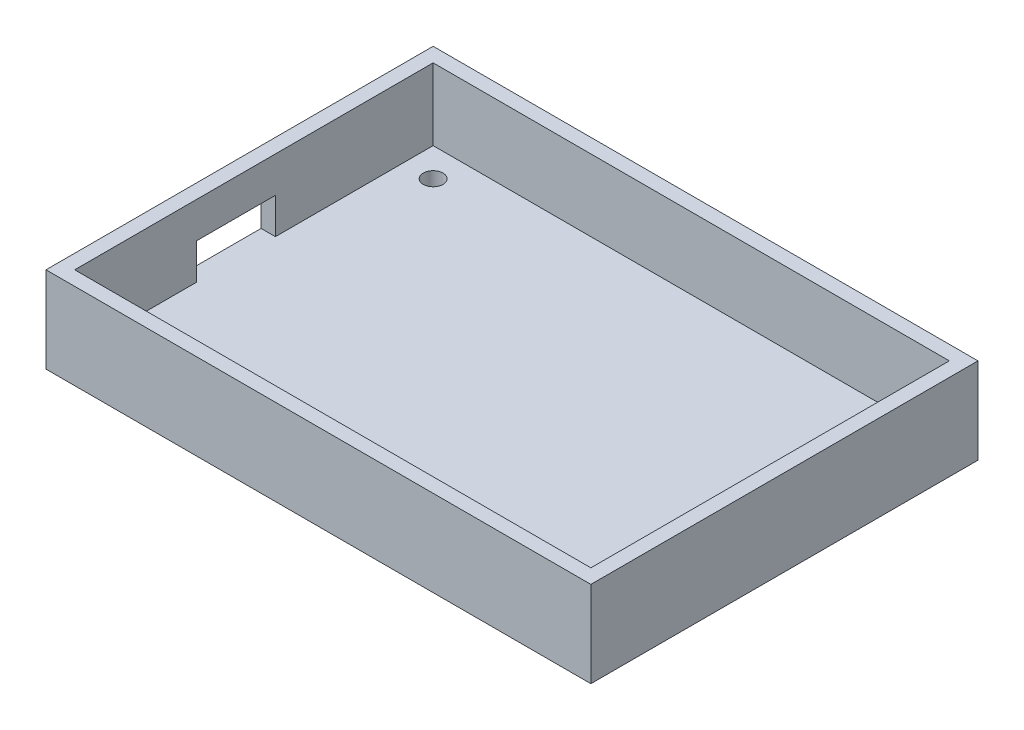
ISO-10303-21;
HEADER;
FILE_DESCRIPTION(('STEP AP214'),'2;1');
FILE_NAME('part.step','',(''),(''),'','','');
FILE_SCHEMA(('AUTOMOTIVE_DESIGN { 1 0 10303 214 1 1 1 1 }'));
ENDSEC;
DATA;
#1=APPLICATION_CONTEXT('core data for automotive mechanical design processes');
#2=APPLICATION_PROTOCOL_DEFINITION('international standard','automotive_design',2000,#1);
#3=PRODUCT_CONTEXT('',#1,'mechanical');
#4=PRODUCT('Part','Part','',(#3));
#5=PRODUCT_RELATED_PRODUCT_CATEGORY('part','',(#4));
#6=PRODUCT_DEFINITION_FORMATION('','',#4);
#7=PRODUCT_DEFINITION_CONTEXT('part definition',#1,'design');
#8=PRODUCT_DEFINITION('design','',#6,#7);
#9=PRODUCT_DEFINITION_SHAPE('','',#8);
#10=(LENGTH_UNIT() NAMED_UNIT(*) SI_UNIT(.MILLI.,.METRE.));
#11=(NAMED_UNIT(*) PLANE_ANGLE_UNIT() SI_UNIT($,.RADIAN.));
#12=(NAMED_UNIT(*) SI_UNIT($,.STERADIAN.) SOLID_ANGLE_UNIT());
#13=UNCERTAINTY_MEASURE_WITH_UNIT(LENGTH_MEASURE(1.E-05),#10,'distance_accuracy_value','');
#14=(GEOMETRIC_REPRESENTATION_CONTEXT(3) GLOBAL_UNCERTAINTY_ASSIGNED_CONTEXT((#13)) GLOBAL_UNIT_ASSIGNED_CONTEXT((#10,
#11,#12)) REPRESENTATION_CONTEXT('',''));
#15=CARTESIAN_POINT('',(0.,0.,0.));
#16=DIRECTION('',(0.,0.,1.));
#17=DIRECTION('',(1.,0.,0.));
#18=AXIS2_PLACEMENT_3D('',#15,#16,#17);
#19=CARTESIAN_POINT('',(48.26,2.54,34.29));
#20=DIRECTION('',(-1.,0.,0.));
#21=DIRECTION('',(0.,0.,1.));
#22=AXIS2_PLACEMENT_3D('',#19,#20,#21);
#23=PLANE('',#22);
#24=DIRECTION('',(0.,0.,-1.));
#25=VECTOR('',#24,1.);
#26=CARTESIAN_POINT('',(48.26,0.,34.29));
#27=LINE('',#26,#25);
#28=CARTESIAN_POINT('',(48.26,0.,34.29));
#29=VERTEX_POINT('',#28);
#30=CARTESIAN_POINT('',(48.26,0.,-34.29));
#31=VERTEX_POINT('',#30);
#32=EDGE_CURVE('E194',#29,#31,#27,.T.);
#33=ORIENTED_EDGE('',*,*,#32,.T.);
#34=DIRECTION('',(0.,-1.,0.));
#35=VECTOR('',#34,1.);
#36=CARTESIAN_POINT('',(48.26,2.54,-34.29));
#37=LINE('',#36,#35);
#38=CARTESIAN_POINT('',(48.26,15.24,-34.29));
#39=VERTEX_POINT('',#38);
#40=EDGE_CURVE('E40',#39,#31,#37,.T.);
#41=ORIENTED_EDGE('',*,*,#40,.F.);
#42=DIRECTION('',(0.,0.,-1.));
#43=VECTOR('',#42,1.);
#44=CARTESIAN_POINT('',(48.26,15.24,34.29));
#45=LINE('',#44,#43);
#46=CARTESIAN_POINT('',(48.26,15.24,34.29));
#47=VERTEX_POINT('',#46);
#48=EDGE_CURVE('E185',#47,#39,#45,.T.);
#49=ORIENTED_EDGE('',*,*,#48,.F.);
#50=DIRECTION('',(0.,-1.,0.));
#51=VECTOR('',#50,1.);
#52=CARTESIAN_POINT('',(48.26,2.54,34.29));
#53=LINE('',#52,#51);
#54=EDGE_CURVE('E203',#47,#29,#53,.T.);
#55=ORIENTED_EDGE('',*,*,#54,.T.);
#56=EDGE_LOOP('',(#33,#41,#49,#55));
#57=FACE_BOUND('',#56,.T.);
#58=ADVANCED_FACE('F33',(#57),#23,.F.);
#59=CARTESIAN_POINT('',(-48.26,2.54,-34.29));
#60=DIRECTION('',(0.,0.,1.));
#61=DIRECTION('',(1.,0.,0.));
#62=AXIS2_PLACEMENT_3D('',#59,#60,#61);
#63=PLANE('',#62);
#64=DIRECTION('',(-1.,0.,0.));
#65=VECTOR('',#64,1.);
#66=CARTESIAN_POINT('',(-48.26,0.,-34.29));
#67=LINE('',#66,#65);
#68=CARTESIAN_POINT('',(-48.26,0.,-34.29));
#69=VERTEX_POINT('',#68);
#70=EDGE_CURVE('E197',#31,#69,#67,.T.);
#71=ORIENTED_EDGE('',*,*,#70,.T.);
#72=DIRECTION('',(0.,-1.,0.));
#73=VECTOR('',#72,1.);
#74=CARTESIAN_POINT('',(-48.26,2.54,-34.29));
#75=LINE('',#74,#73);
#76=CARTESIAN_POINT('',(-48.26,15.24,-34.29));
#77=VERTEX_POINT('',#76);
#78=EDGE_CURVE('E209',#77,#69,#75,.T.);
#79=ORIENTED_EDGE('',*,*,#78,.F.);
#80=DIRECTION('',(-1.,0.,0.));
#81=VECTOR('',#80,1.);
#82=CARTESIAN_POINT('',(48.26,15.24,-34.29));
#83=LINE('',#82,#81);
#84=EDGE_CURVE('E188',#39,#77,#83,.T.);
#85=ORIENTED_EDGE('',*,*,#84,.F.);
#86=ORIENTED_EDGE('',*,*,#40,.T.);
#87=EDGE_LOOP('',(#71,#79,#85,#86));
#88=FACE_BOUND('',#87,.T.);
#89=ADVANCED_FACE('F214',(#88),#63,.F.);
#90=CARTESIAN_POINT('',(-48.26,2.54,34.29));
#91=DIRECTION('',(1.,0.,0.));
#92=DIRECTION('',(0.,0.,-1.));
#93=AXIS2_PLACEMENT_3D('',#90,#91,#92);
#94=PLANE('',#93);
#95=DIRECTION('',(0.,0.,-1.));
#96=VECTOR('',#95,1.);
#97=CARTESIAN_POINT('',(-48.26,8.89,-3.81000000000001));
#98=LINE('',#97,#96);
#99=CARTESIAN_POINT('',(-48.26,8.89,10.16));
#100=VERTEX_POINT('',#99);
#101=CARTESIAN_POINT('',(-48.26,8.89,-3.81000000000001));
#102=VERTEX_POINT('',#101);
#103=EDGE_CURVE('E131',#100,#102,#98,.T.);
#104=ORIENTED_EDGE('',*,*,#103,.F.);
#105=DIRECTION('',(0.,1.,0.));
#106=VECTOR('',#105,1.);
#107=CARTESIAN_POINT('',(-48.26,8.89,10.16));
#108=LINE('',#107,#106);
#109=CARTESIAN_POINT('',(-48.26,2.54,10.16));
#110=VERTEX_POINT('',#109);
#111=EDGE_CURVE('E47',#110,#100,#108,.T.);
#112=ORIENTED_EDGE('',*,*,#111,.F.);
#113=DIRECTION('',(0.,0.,1.));
#114=VECTOR('',#113,1.);
#115=CARTESIAN_POINT('',(-48.26,2.54,-3.81000000000001));
#116=LINE('',#115,#114);
#117=CARTESIAN_POINT('',(-48.26,2.54,-3.81000000000001));
#118=VERTEX_POINT('',#117);
#119=EDGE_CURVE('E138',#118,#110,#116,.T.);
#120=ORIENTED_EDGE('',*,*,#119,.F.);
#121=DIRECTION('',(0.,-1.,0.));
#122=VECTOR('',#121,1.);
#123=CARTESIAN_POINT('',(-48.26,8.89,-3.81000000000001));
#124=LINE('',#123,#122);
#125=EDGE_CURVE('E122',#102,#118,#124,.T.);
#126=ORIENTED_EDGE('',*,*,#125,.F.);
#127=EDGE_LOOP('',(#104,#112,#120,#126));
#128=FACE_BOUND('',#127,.T.);
#129=DIRECTION('',(0.,0.,1.));
#130=VECTOR('',#129,1.);
#131=CARTESIAN_POINT('',(-48.26,0.,34.29));
#132=LINE('',#131,#130);
#133=CARTESIAN_POINT('',(-48.26,0.,34.29));
#134=VERTEX_POINT('',#133);
#135=EDGE_CURVE('E199',#69,#134,#132,.T.);
#136=ORIENTED_EDGE('',*,*,#135,.T.);
#137=DIRECTION('',(0.,-1.,0.));
#138=VECTOR('',#137,1.);
#139=CARTESIAN_POINT('',(-48.26,2.54,34.29));
#140=LINE('',#139,#138);
#141=CARTESIAN_POINT('',(-48.26,15.24,34.29));
#142=VERTEX_POINT('',#141);
#143=EDGE_CURVE('E206',#142,#134,#140,.T.);
#144=ORIENTED_EDGE('',*,*,#143,.F.);
#145=DIRECTION('',(0.,0.,1.));
#146=VECTOR('',#145,1.);
#147=CARTESIAN_POINT('',(-48.26,15.24,-34.29));
#148=LINE('',#147,#146);
#149=EDGE_CURVE('E191',#77,#142,#148,.T.);
#150=ORIENTED_EDGE('',*,*,#149,.F.);
#151=ORIENTED_EDGE('',*,*,#78,.T.);
#152=EDGE_LOOP('',(#136,#144,#150,#151));
#153=FACE_BOUND('',#152,.T.);
#154=ADVANCED_FACE('F135',(#128,#153),#94,.F.);
#155=CARTESIAN_POINT('',(-48.26,2.54,34.29));
#156=DIRECTION('',(0.,0.,-1.));
#157=DIRECTION('',(-1.,0.,0.));
#158=AXIS2_PLACEMENT_3D('',#155,#156,#157);
#159=PLANE('',#158);
#160=DIRECTION('',(1.,0.,0.));
#161=VECTOR('',#160,1.);
#162=CARTESIAN_POINT('',(-48.26,0.,34.29));
#163=LINE('',#162,#161);
#164=EDGE_CURVE('E201',#134,#29,#163,.T.);
#165=ORIENTED_EDGE('',*,*,#164,.T.);
#166=ORIENTED_EDGE('',*,*,#54,.F.);
#167=DIRECTION('',(1.,0.,0.));
#168=VECTOR('',#167,1.);
#169=CARTESIAN_POINT('',(-48.26,15.24,34.29));
#170=LINE('',#169,#168);
#171=EDGE_CURVE('E182',#142,#47,#170,.T.);
#172=ORIENTED_EDGE('',*,*,#171,.F.);
#173=ORIENTED_EDGE('',*,*,#143,.T.);
#174=EDGE_LOOP('',(#165,#166,#172,#173));
#175=FACE_BOUND('',#174,.T.);
#176=ADVANCED_FACE('F225',(#175),#159,.F.);
#177=CARTESIAN_POINT('',(0.,0.,0.));
#178=DIRECTION('',(0.,-1.,0.));
#179=DIRECTION('',(0.,0.,-1.));
#180=AXIS2_PLACEMENT_3D('',#177,#178,#179);
#181=PLANE('',#180);
#182=CARTESIAN_POINT('',(-40.64,0.,-26.67));
#183=DIRECTION('',(0.,1.,0.));
#184=DIRECTION('',(0.,0.,1.));
#185=AXIS2_PLACEMENT_3D('',#182,#183,#184);
#186=CIRCLE('',#185,1.75);
#187=CARTESIAN_POINT('',(-40.64,0.,-24.92));
#188=VERTEX_POINT('',#187);
#189=EDGE_CURVE('E254',#188,#188,#186,.T.);
#190=ORIENTED_EDGE('',*,*,#189,.T.);
#191=EDGE_LOOP('',(#190));
#192=FACE_BOUND('',#191,.T.);
#193=CARTESIAN_POINT('',(39.37,0.,-26.416));
#194=DIRECTION('',(0.,1.,0.));
#195=DIRECTION('',(0.,0.,1.));
#196=AXIS2_PLACEMENT_3D('',#193,#194,#195);
#197=CIRCLE('',#196,1.75);
#198=CARTESIAN_POINT('',(39.37,0.,-24.666));
#199=VERTEX_POINT('',#198);
#200=EDGE_CURVE('E268',#199,#199,#197,.T.);
#201=ORIENTED_EDGE('',*,*,#200,.T.);
#202=EDGE_LOOP('',(#201));
#203=FACE_BOUND('',#202,.T.);
#204=CARTESIAN_POINT('',(39.37,0.,25.654));
#205=DIRECTION('',(0.,1.,0.));
#206=DIRECTION('',(0.,0.,1.));
#207=AXIS2_PLACEMENT_3D('',#204,#205,#206);
#208=CIRCLE('',#207,1.75);
#209=CARTESIAN_POINT('',(39.37,0.,27.404));
#210=VERTEX_POINT('',#209);
#211=EDGE_CURVE('E262',#210,#210,#208,.T.);
#212=ORIENTED_EDGE('',*,*,#211,.T.);
#213=EDGE_LOOP('',(#212));
#214=FACE_BOUND('',#213,.T.);
#215=ORIENTED_EDGE('',*,*,#32,.F.);
#216=ORIENTED_EDGE('',*,*,#164,.F.);
#217=ORIENTED_EDGE('',*,*,#135,.F.);
#218=ORIENTED_EDGE('',*,*,#70,.F.);
#219=EDGE_LOOP('',(#215,#216,#217,#218));
#220=FACE_BOUND('',#219,.T.);
#221=ADVANCED_FACE('F220',(#192,#203,#214,#220),#181,.T.);
#222=CARTESIAN_POINT('',(0.,15.24,0.));
#223=DIRECTION('',(0.,1.,0.));
#224=DIRECTION('',(0.,0.,1.));
#225=AXIS2_PLACEMENT_3D('',#222,#223,#224);
#226=PLANE('',#225);
#227=ORIENTED_EDGE('',*,*,#171,.T.);
#228=ORIENTED_EDGE('',*,*,#48,.T.);
#229=ORIENTED_EDGE('',*,*,#84,.T.);
#230=ORIENTED_EDGE('',*,*,#149,.T.);
#231=EDGE_LOOP('',(#227,#228,#229,#230));
#232=FACE_BOUND('',#231,.T.);
#233=DIRECTION('',(0.,0.,-1.));
#234=VECTOR('',#233,1.);
#235=CARTESIAN_POINT('',(45.72,15.24,31.75));
#236=LINE('',#235,#234);
#237=CARTESIAN_POINT('',(45.72,15.24,31.75));
#238=VERTEX_POINT('',#237);
#239=CARTESIAN_POINT('',(45.72,15.24,-31.75));
#240=VERTEX_POINT('',#239);
#241=EDGE_CURVE('E153',#238,#240,#236,.T.);
#242=ORIENTED_EDGE('',*,*,#241,.F.);
#243=DIRECTION('',(1.,0.,0.));
#244=VECTOR('',#243,1.);
#245=CARTESIAN_POINT('',(-45.72,15.24,31.75));
#246=LINE('',#245,#244);
#247=CARTESIAN_POINT('',(-45.72,15.24,31.75));
#248=VERTEX_POINT('',#247);
#249=EDGE_CURVE('E151',#248,#238,#246,.T.);
#250=ORIENTED_EDGE('',*,*,#249,.F.);
#251=DIRECTION('',(0.,0.,1.));
#252=VECTOR('',#251,1.);
#253=CARTESIAN_POINT('',(-45.72,15.24,-31.75));
#254=LINE('',#253,#252);
#255=CARTESIAN_POINT('',(-45.72,15.24,-31.75));
#256=VERTEX_POINT('',#255);
#257=EDGE_CURVE('E159',#256,#248,#254,.T.);
#258=ORIENTED_EDGE('',*,*,#257,.F.);
#259=DIRECTION('',(-1.,0.,0.));
#260=VECTOR('',#259,1.);
#261=CARTESIAN_POINT('',(45.72,15.24,-31.75));
#262=LINE('',#261,#260);
#263=EDGE_CURVE('E156',#240,#256,#262,.T.);
#264=ORIENTED_EDGE('',*,*,#263,.F.);
#265=EDGE_LOOP('',(#242,#250,#258,#264));
#266=FACE_BOUND('',#265,.T.);
#267=ADVANCED_FACE('F227',(#232,#266),#226,.T.);
#268=CARTESIAN_POINT('',(-45.72,15.24,31.75));
#269=DIRECTION('',(0.,0.,-1.));
#270=DIRECTION('',(-1.,0.,0.));
#271=AXIS2_PLACEMENT_3D('',#268,#269,#270);
#272=PLANE('',#271);
#273=DIRECTION('',(1.,0.,0.));
#274=VECTOR('',#273,1.);
#275=CARTESIAN_POINT('',(-45.72,2.54,31.75));
#276=LINE('',#275,#274);
#277=CARTESIAN_POINT('',(-45.72,2.54,31.75));
#278=VERTEX_POINT('',#277);
#279=CARTESIAN_POINT('',(45.72,2.54,31.75));
#280=VERTEX_POINT('',#279);
#281=EDGE_CURVE('E150',#278,#280,#276,.T.);
#282=ORIENTED_EDGE('',*,*,#281,.F.);
#283=DIRECTION('',(0.,-1.,0.));
#284=VECTOR('',#283,1.);
#285=CARTESIAN_POINT('',(-45.72,15.24,31.75));
#286=LINE('',#285,#284);
#287=EDGE_CURVE('E161',#248,#278,#286,.T.);
#288=ORIENTED_EDGE('',*,*,#287,.F.);
#289=ORIENTED_EDGE('',*,*,#249,.T.);
#290=DIRECTION('',(0.,-1.,0.));
#291=VECTOR('',#290,1.);
#292=CARTESIAN_POINT('',(45.72,15.24,31.75));
#293=LINE('',#292,#291);
#294=EDGE_CURVE('E179',#238,#280,#293,.T.);
#295=ORIENTED_EDGE('',*,*,#294,.T.);
#296=EDGE_LOOP('',(#282,#288,#289,#295));
#297=FACE_BOUND('',#296,.T.);
#298=ADVANCED_FACE('F230',(#297),#272,.T.);
#299=CARTESIAN_POINT('',(45.72,15.24,31.75));
#300=DIRECTION('',(-1.,0.,0.));
#301=DIRECTION('',(0.,0.,1.));
#302=AXIS2_PLACEMENT_3D('',#299,#300,#301);
#303=PLANE('',#302);
#304=DIRECTION('',(0.,0.,-1.));
#305=VECTOR('',#304,1.);
#306=CARTESIAN_POINT('',(45.72,2.54,31.75));
#307=LINE('',#306,#305);
#308=CARTESIAN_POINT('',(45.72,2.54,-31.75));
#309=VERTEX_POINT('',#308);
#310=EDGE_CURVE('E164',#280,#309,#307,.T.);
#311=ORIENTED_EDGE('',*,*,#310,.F.);
#312=ORIENTED_EDGE('',*,*,#294,.F.);
#313=ORIENTED_EDGE('',*,*,#241,.T.);
#314=DIRECTION('',(0.,-1.,0.));
#315=VECTOR('',#314,1.);
#316=CARTESIAN_POINT('',(45.72,15.24,-31.75));
#317=LINE('',#316,#315);
#318=EDGE_CURVE('E177',#240,#309,#317,.T.);
#319=ORIENTED_EDGE('',*,*,#318,.T.);
#320=EDGE_LOOP('',(#311,#312,#313,#319));
#321=FACE_BOUND('',#320,.T.);
#322=ADVANCED_FACE('F239',(#321),#303,.T.);
#323=CARTESIAN_POINT('',(45.72,15.24,-31.75));
#324=DIRECTION('',(0.,0.,1.));
#325=DIRECTION('',(1.,0.,0.));
#326=AXIS2_PLACEMENT_3D('',#323,#324,#325);
#327=PLANE('',#326);
#328=DIRECTION('',(-1.,0.,0.));
#329=VECTOR('',#328,1.);
#330=CARTESIAN_POINT('',(45.72,2.54,-31.75));
#331=LINE('',#330,#329);
#332=CARTESIAN_POINT('',(-45.72,2.54,-31.75));
#333=VERTEX_POINT('',#332);
#334=EDGE_CURVE('E167',#309,#333,#331,.T.);
#335=ORIENTED_EDGE('',*,*,#334,.F.);
#336=ORIENTED_EDGE('',*,*,#318,.F.);
#337=ORIENTED_EDGE('',*,*,#263,.T.);
#338=DIRECTION('',(0.,-1.,0.));
#339=VECTOR('',#338,1.);
#340=CARTESIAN_POINT('',(-45.72,15.24,-31.75));
#341=LINE('',#340,#339);
#342=EDGE_CURVE('E175',#256,#333,#341,.T.);
#343=ORIENTED_EDGE('',*,*,#342,.T.);
#344=EDGE_LOOP('',(#335,#336,#337,#343));
#345=FACE_BOUND('',#344,.T.);
#346=ADVANCED_FACE('F242',(#345),#327,.T.);
#347=CARTESIAN_POINT('',(-45.72,15.24,-31.75));
#348=DIRECTION('',(1.,0.,0.));
#349=DIRECTION('',(0.,0.,-1.));
#350=AXIS2_PLACEMENT_3D('',#347,#348,#349);
#351=PLANE('',#350);
#352=DIRECTION('',(0.,-1.,0.));
#353=VECTOR('',#352,1.);
#354=CARTESIAN_POINT('',(-45.72,15.24,10.16));
#355=LINE('',#354,#353);
#356=CARTESIAN_POINT('',(-45.72,8.89,10.16));
#357=VERTEX_POINT('',#356);
#358=CARTESIAN_POINT('',(-45.72,2.54,10.16));
#359=VERTEX_POINT('',#358);
#360=EDGE_CURVE('E148',#357,#359,#355,.T.);
#361=ORIENTED_EDGE('',*,*,#360,.F.);
#362=DIRECTION('',(0.,0.,1.));
#363=VECTOR('',#362,1.);
#364=CARTESIAN_POINT('',(-45.72,8.89,-31.75));
#365=LINE('',#364,#363);
#366=CARTESIAN_POINT('',(-45.72,8.89,-3.81000000000001));
#367=VERTEX_POINT('',#366);
#368=EDGE_CURVE('E11',#367,#357,#365,.T.);
#369=ORIENTED_EDGE('',*,*,#368,.F.);
#370=DIRECTION('',(0.,1.,0.));
#371=VECTOR('',#370,1.);
#372=CARTESIAN_POINT('',(-45.72,15.24,-3.81000000000001));
#373=LINE('',#372,#371);
#374=CARTESIAN_POINT('',(-45.72,2.54,-3.81000000000001));
#375=VERTEX_POINT('',#374);
#376=EDGE_CURVE('E125',#375,#367,#373,.T.);
#377=ORIENTED_EDGE('',*,*,#376,.F.);
#378=DIRECTION('',(0.,0.,1.));
#379=VECTOR('',#378,1.);
#380=CARTESIAN_POINT('',(-45.72,2.54,-31.75));
#381=LINE('',#380,#379);
#382=EDGE_CURVE('E154',#333,#375,#381,.T.);
#383=ORIENTED_EDGE('',*,*,#382,.F.);
#384=ORIENTED_EDGE('',*,*,#342,.F.);
#385=ORIENTED_EDGE('',*,*,#257,.T.);
#386=ORIENTED_EDGE('',*,*,#287,.T.);
#387=EDGE_CURVE('E170',#359,#278,#381,.T.);
#388=ORIENTED_EDGE('',*,*,#387,.F.);
#389=EDGE_LOOP('',(#361,#369,#377,#383,#384,#385,#386,#388));
#390=FACE_BOUND('',#389,.T.);
#391=ADVANCED_FACE('F252',(#390),#351,.T.);
#392=CARTESIAN_POINT('',(0.,2.54,0.));
#393=DIRECTION('',(0.,-1.,0.));
#394=DIRECTION('',(0.,0.,-1.));
#395=AXIS2_PLACEMENT_3D('',#392,#393,#394);
#396=PLANE('',#395);
#397=CARTESIAN_POINT('',(-40.64,2.54,-26.67));
#398=DIRECTION('',(0.,1.,0.));
#399=DIRECTION('',(0.,0.,1.));
#400=AXIS2_PLACEMENT_3D('',#397,#398,#399);
#401=CIRCLE('',#400,1.75);
#402=CARTESIAN_POINT('',(-40.64,2.54,-24.92));
#403=VERTEX_POINT('',#402);
#404=EDGE_CURVE('E256',#403,#403,#401,.T.);
#405=ORIENTED_EDGE('',*,*,#404,.F.);
#406=EDGE_LOOP('',(#405));
#407=FACE_BOUND('',#406,.T.);
#408=CARTESIAN_POINT('',(39.37,2.54,-26.416));
#409=DIRECTION('',(0.,1.,0.));
#410=DIRECTION('',(0.,0.,1.));
#411=AXIS2_PLACEMENT_3D('',#408,#409,#410);
#412=CIRCLE('',#411,1.75);
#413=CARTESIAN_POINT('',(39.37,2.54,-24.666));
#414=VERTEX_POINT('',#413);
#415=EDGE_CURVE('E265',#414,#414,#412,.T.);
#416=ORIENTED_EDGE('',*,*,#415,.F.);
#417=EDGE_LOOP('',(#416));
#418=FACE_BOUND('',#417,.T.);
#419=CARTESIAN_POINT('',(39.37,2.54,25.654));
#420=DIRECTION('',(0.,1.,0.));
#421=DIRECTION('',(0.,0.,1.));
#422=AXIS2_PLACEMENT_3D('',#419,#420,#421);
#423=CIRCLE('',#422,1.75);
#424=CARTESIAN_POINT('',(39.37,2.54,27.404));
#425=VERTEX_POINT('',#424);
#426=EDGE_CURVE('E259',#425,#425,#423,.T.);
#427=ORIENTED_EDGE('',*,*,#426,.F.);
#428=EDGE_LOOP('',(#427));
#429=FACE_BOUND('',#428,.T.);
#430=ORIENTED_EDGE('',*,*,#382,.T.);
#431=DIRECTION('',(-1.,0.,0.));
#432=VECTOR('',#431,1.);
#433=CARTESIAN_POINT('',(-35.56,2.54,-3.81000000000001));
#434=LINE('',#433,#432);
#435=EDGE_CURVE('E127',#375,#118,#434,.T.);
#436=ORIENTED_EDGE('',*,*,#435,.T.);
#437=ORIENTED_EDGE('',*,*,#119,.T.);
#438=DIRECTION('',(-1.,0.,0.));
#439=VECTOR('',#438,1.);
#440=CARTESIAN_POINT('',(-35.56,2.54,10.16));
#441=LINE('',#440,#439);
#442=EDGE_CURVE('E143',#359,#110,#441,.T.);
#443=ORIENTED_EDGE('',*,*,#442,.F.);
#444=ORIENTED_EDGE('',*,*,#387,.T.);
#445=ORIENTED_EDGE('',*,*,#281,.T.);
#446=ORIENTED_EDGE('',*,*,#310,.T.);
#447=ORIENTED_EDGE('',*,*,#334,.T.);
#448=EDGE_LOOP('',(#430,#436,#437,#443,#444,#445,#446,#447));
#449=FACE_BOUND('',#448,.T.);
#450=ADVANCED_FACE('F245',(#407,#418,#429,#449),#396,.F.);
#451=CARTESIAN_POINT('',(-35.56,8.89,10.16));
#452=DIRECTION('',(0.,0.,1.));
#453=DIRECTION('',(1.,0.,0.));
#454=AXIS2_PLACEMENT_3D('',#451,#452,#453);
#455=PLANE('',#454);
#456=ORIENTED_EDGE('',*,*,#360,.T.);
#457=ORIENTED_EDGE('',*,*,#442,.T.);
#458=ORIENTED_EDGE('',*,*,#111,.T.);
#459=DIRECTION('',(-1.,0.,0.));
#460=VECTOR('',#459,1.);
#461=CARTESIAN_POINT('',(-35.56,8.89,10.16));
#462=LINE('',#461,#460);
#463=EDGE_CURVE('E128',#357,#100,#462,.T.);
#464=ORIENTED_EDGE('',*,*,#463,.F.);
#465=EDGE_LOOP('',(#456,#457,#458,#464));
#466=FACE_BOUND('',#465,.T.);
#467=ADVANCED_FACE('F278',(#466),#455,.F.);
#468=CARTESIAN_POINT('',(-35.56,8.89,-3.81000000000001));
#469=DIRECTION('',(0.,0.,-1.));
#470=DIRECTION('',(0.,1.,0.));
#471=AXIS2_PLACEMENT_3D('',#468,#469,#470);
#472=PLANE('',#471);
#473=ORIENTED_EDGE('',*,*,#376,.T.);
#474=DIRECTION('',(-1.,0.,0.));
#475=VECTOR('',#474,1.);
#476=CARTESIAN_POINT('',(-35.56,8.89,-3.81000000000001));
#477=LINE('',#476,#475);
#478=EDGE_CURVE('E54',#367,#102,#477,.T.);
#479=ORIENTED_EDGE('',*,*,#478,.T.);
#480=ORIENTED_EDGE('',*,*,#125,.T.);
#481=ORIENTED_EDGE('',*,*,#435,.F.);
#482=EDGE_LOOP('',(#473,#479,#480,#481));
#483=FACE_BOUND('',#482,.T.);
#484=ADVANCED_FACE('F120',(#483),#472,.F.);
#485=CARTESIAN_POINT('',(-35.56,8.89,-3.81000000000001));
#486=DIRECTION('',(0.,1.,0.));
#487=DIRECTION('',(0.,0.,1.));
#488=AXIS2_PLACEMENT_3D('',#485,#486,#487);
#489=PLANE('',#488);
#490=ORIENTED_EDGE('',*,*,#368,.T.);
#491=ORIENTED_EDGE('',*,*,#463,.T.);
#492=ORIENTED_EDGE('',*,*,#103,.T.);
#493=ORIENTED_EDGE('',*,*,#478,.F.);
#494=EDGE_LOOP('',(#490,#491,#492,#493));
#495=FACE_BOUND('',#494,.T.);
#496=ADVANCED_FACE('F132',(#495),#489,.F.);
#497=CARTESIAN_POINT('',(39.37,0.,25.654));
#498=DIRECTION('',(0.,1.,0.));
#499=DIRECTION('',(0.,0.,1.));
#500=AXIS2_PLACEMENT_3D('',#497,#498,#499);
#501=CYLINDRICAL_SURFACE('',#500,1.75);
#502=ORIENTED_EDGE('',*,*,#211,.F.);
#503=EDGE_LOOP('',(#502));
#504=FACE_BOUND('',#503,.T.);
#505=ORIENTED_EDGE('',*,*,#426,.T.);
#506=EDGE_LOOP('',(#505));
#507=FACE_BOUND('',#506,.T.);
#508=ADVANCED_FACE('F284',(#504,#507),#501,.F.);
#509=CARTESIAN_POINT('',(39.37,0.,-26.416));
#510=DIRECTION('',(0.,1.,0.));
#511=DIRECTION('',(0.,0.,1.));
#512=AXIS2_PLACEMENT_3D('',#509,#510,#511);
#513=CYLINDRICAL_SURFACE('',#512,1.75);
#514=ORIENTED_EDGE('',*,*,#200,.F.);
#515=EDGE_LOOP('',(#514));
#516=FACE_BOUND('',#515,.T.);
#517=ORIENTED_EDGE('',*,*,#415,.T.);
#518=EDGE_LOOP('',(#517));
#519=FACE_BOUND('',#518,.T.);
#520=ADVANCED_FACE('F286',(#516,#519),#513,.F.);
#521=CARTESIAN_POINT('',(-40.64,0.,-26.67));
#522=DIRECTION('',(0.,1.,0.));
#523=DIRECTION('',(0.,0.,1.));
#524=AXIS2_PLACEMENT_3D('',#521,#522,#523);
#525=CYLINDRICAL_SURFACE('',#524,1.75);
#526=ORIENTED_EDGE('',*,*,#189,.F.);
#527=EDGE_LOOP('',(#526));
#528=FACE_BOUND('',#527,.T.);
#529=ORIENTED_EDGE('',*,*,#404,.T.);
#530=EDGE_LOOP('',(#529));
#531=FACE_BOUND('',#530,.T.);
#532=ADVANCED_FACE('F274',(#528,#531),#525,.F.);
#533=CLOSED_SHELL('',(#58,#89,#154,#176,#221,#267,#298,#322,#346,#391,#450,#467,#484,#496,#508,
#520,#532));
#534=MANIFOLD_SOLID_BREP('B2',#533);
#535=ADVANCED_BREP_SHAPE_REPRESENTATION('',(#18,#534),#14);
#536=SHAPE_DEFINITION_REPRESENTATION(#9,#535);
ENDSEC;
END-ISO-10303-21;
